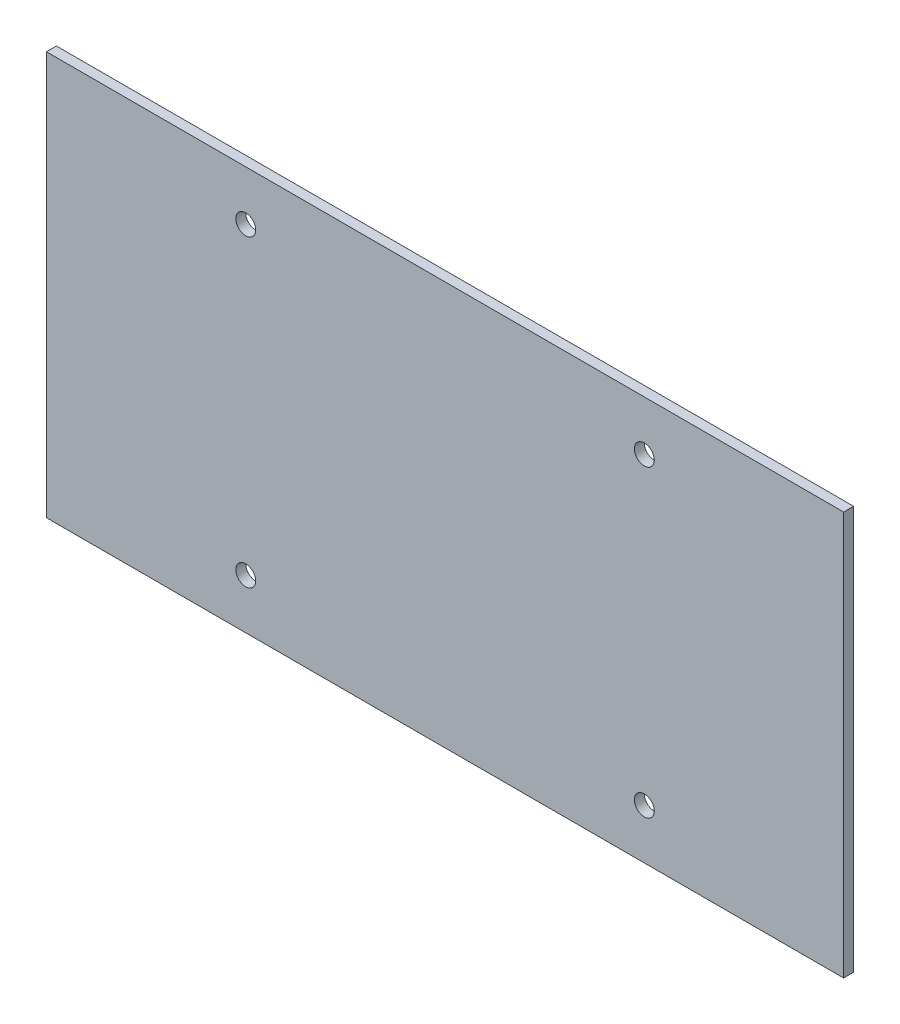
ISO-10303-21;
HEADER;
FILE_DESCRIPTION(('STEP AP214'),'2;1');
FILE_NAME('part.step','',(''),(''),'','','');
FILE_SCHEMA(('AUTOMOTIVE_DESIGN { 1 0 10303 214 1 1 1 1 }'));
ENDSEC;
DATA;
#1=APPLICATION_CONTEXT('core data for automotive mechanical design processes');
#2=APPLICATION_PROTOCOL_DEFINITION('international standard','automotive_design',2000,#1);
#3=PRODUCT_CONTEXT('',#1,'mechanical');
#4=PRODUCT('Part','Part','',(#3));
#5=PRODUCT_RELATED_PRODUCT_CATEGORY('part','',(#4));
#6=PRODUCT_DEFINITION_FORMATION('','',#4);
#7=PRODUCT_DEFINITION_CONTEXT('part definition',#1,'design');
#8=PRODUCT_DEFINITION('design','',#6,#7);
#9=PRODUCT_DEFINITION_SHAPE('','',#8);
#10=(LENGTH_UNIT() NAMED_UNIT(*) SI_UNIT(.MILLI.,.METRE.));
#11=(NAMED_UNIT(*) PLANE_ANGLE_UNIT() SI_UNIT($,.RADIAN.));
#12=(NAMED_UNIT(*) SI_UNIT($,.STERADIAN.) SOLID_ANGLE_UNIT());
#13=UNCERTAINTY_MEASURE_WITH_UNIT(LENGTH_MEASURE(1.E-05),#10,'distance_accuracy_value','');
#14=(GEOMETRIC_REPRESENTATION_CONTEXT(3) GLOBAL_UNCERTAINTY_ASSIGNED_CONTEXT((#13)) GLOBAL_UNIT_ASSIGNED_CONTEXT((#10,
#11,#12)) REPRESENTATION_CONTEXT('',''));
#15=CARTESIAN_POINT('',(0.,0.,0.));
#16=DIRECTION('',(0.,0.,1.));
#17=DIRECTION('',(1.,0.,0.));
#18=AXIS2_PLACEMENT_3D('',#15,#16,#17);
#19=CARTESIAN_POINT('',(0.,0.,2.));
#20=DIRECTION('',(0.,0.,-1.));
#21=DIRECTION('',(-1.,0.,0.));
#22=AXIS2_PLACEMENT_3D('',#19,#20,#21);
#23=PLANE('',#22);
#24=DIRECTION('',(0.,-1.,0.));
#25=VECTOR('',#24,1.);
#26=CARTESIAN_POINT('',(0.,0.,2.));
#27=LINE('',#26,#25);
#28=CARTESIAN_POINT('',(0.,81.,2.));
#29=VERTEX_POINT('',#28);
#30=CARTESIAN_POINT('',(0.,0.,2.));
#31=VERTEX_POINT('',#30);
#32=EDGE_CURVE('E92',#29,#31,#27,.T.);
#33=ORIENTED_EDGE('',*,*,#32,.T.);
#34=DIRECTION('',(1.,0.,0.));
#35=VECTOR('',#34,1.);
#36=CARTESIAN_POINT('',(0.,0.,2.));
#37=LINE('',#36,#35);
#38=CARTESIAN_POINT('',(160.,0.,2.));
#39=VERTEX_POINT('',#38);
#40=EDGE_CURVE('E87',#31,#39,#37,.T.);
#41=ORIENTED_EDGE('',*,*,#40,.T.);
#42=DIRECTION('',(0.,1.,0.));
#43=VECTOR('',#42,1.);
#44=CARTESIAN_POINT('',(160.,0.,2.));
#45=LINE('',#44,#43);
#46=CARTESIAN_POINT('',(160.,81.,2.));
#47=VERTEX_POINT('',#46);
#48=EDGE_CURVE('E90',#39,#47,#45,.T.);
#49=ORIENTED_EDGE('',*,*,#48,.T.);
#50=DIRECTION('',(-1.,0.,0.));
#51=VECTOR('',#50,1.);
#52=CARTESIAN_POINT('',(0.,81.,2.));
#53=LINE('',#52,#51);
#54=EDGE_CURVE('E57',#47,#29,#53,.T.);
#55=ORIENTED_EDGE('',*,*,#54,.T.);
#56=EDGE_LOOP('',(#33,#41,#49,#55));
#57=FACE_BOUND('',#56,.T.);
#58=CARTESIAN_POINT('',(40.,71.,2.));
#59=DIRECTION('',(0.,0.,1.));
#60=DIRECTION('',(1.,0.,0.));
#61=AXIS2_PLACEMENT_3D('',#58,#59,#60);
#62=CIRCLE('',#61,2.);
#63=CARTESIAN_POINT('',(42.,71.,2.));
#64=VERTEX_POINT('',#63);
#65=EDGE_CURVE('E112',#64,#64,#62,.T.);
#66=ORIENTED_EDGE('',*,*,#65,.F.);
#67=EDGE_LOOP('',(#66));
#68=FACE_BOUND('',#67,.T.);
#69=CARTESIAN_POINT('',(120.,71.,2.));
#70=DIRECTION('',(0.,0.,1.));
#71=DIRECTION('',(1.,0.,0.));
#72=AXIS2_PLACEMENT_3D('',#69,#70,#71);
#73=CIRCLE('',#72,2.);
#74=CARTESIAN_POINT('',(122.,71.,2.));
#75=VERTEX_POINT('',#74);
#76=EDGE_CURVE('E134',#75,#75,#73,.T.);
#77=ORIENTED_EDGE('',*,*,#76,.F.);
#78=EDGE_LOOP('',(#77));
#79=FACE_BOUND('',#78,.T.);
#80=CARTESIAN_POINT('',(40.,10.,2.));
#81=DIRECTION('',(0.,0.,1.));
#82=DIRECTION('',(1.,0.,0.));
#83=AXIS2_PLACEMENT_3D('',#80,#81,#82);
#84=CIRCLE('',#83,2.);
#85=CARTESIAN_POINT('',(42.,10.,2.));
#86=VERTEX_POINT('',#85);
#87=EDGE_CURVE('E142',#86,#86,#84,.T.);
#88=ORIENTED_EDGE('',*,*,#87,.F.);
#89=EDGE_LOOP('',(#88));
#90=FACE_BOUND('',#89,.T.);
#91=CARTESIAN_POINT('',(120.,10.,2.));
#92=DIRECTION('',(0.,0.,1.));
#93=DIRECTION('',(1.,0.,0.));
#94=AXIS2_PLACEMENT_3D('',#91,#92,#93);
#95=CIRCLE('',#94,2.);
#96=CARTESIAN_POINT('',(122.,10.,2.));
#97=VERTEX_POINT('',#96);
#98=EDGE_CURVE('E150',#97,#97,#95,.T.);
#99=ORIENTED_EDGE('',*,*,#98,.F.);
#100=EDGE_LOOP('',(#99));
#101=FACE_BOUND('',#100,.T.);
#102=ADVANCED_FACE('F39',(#57,#68,#79,#90,#101),#23,.F.);
#103=CARTESIAN_POINT('',(0.,0.,0.));
#104=DIRECTION('',(0.,0.,-1.));
#105=DIRECTION('',(-1.,0.,0.));
#106=AXIS2_PLACEMENT_3D('',#103,#104,#105);
#107=PLANE('',#106);
#108=CARTESIAN_POINT('',(40.,10.,0.));
#109=DIRECTION('',(0.,0.,1.));
#110=DIRECTION('',(1.,0.,0.));
#111=AXIS2_PLACEMENT_3D('',#108,#109,#110);
#112=CIRCLE('',#111,2.);
#113=CARTESIAN_POINT('',(42.,10.,0.));
#114=VERTEX_POINT('',#113);
#115=EDGE_CURVE('E146',#114,#114,#112,.T.);
#116=ORIENTED_EDGE('',*,*,#115,.T.);
#117=EDGE_LOOP('',(#116));
#118=FACE_BOUND('',#117,.T.);
#119=CARTESIAN_POINT('',(40.,71.,0.));
#120=DIRECTION('',(0.,0.,1.));
#121=DIRECTION('',(1.,0.,0.));
#122=AXIS2_PLACEMENT_3D('',#119,#120,#121);
#123=CIRCLE('',#122,2.);
#124=CARTESIAN_POINT('',(42.,71.,0.));
#125=VERTEX_POINT('',#124);
#126=EDGE_CURVE('E130',#125,#125,#123,.T.);
#127=ORIENTED_EDGE('',*,*,#126,.T.);
#128=EDGE_LOOP('',(#127));
#129=FACE_BOUND('',#128,.T.);
#130=DIRECTION('',(0.,-1.,0.));
#131=VECTOR('',#130,1.);
#132=CARTESIAN_POINT('',(0.,0.,0.));
#133=LINE('',#132,#131);
#134=CARTESIAN_POINT('',(0.,81.,0.));
#135=VERTEX_POINT('',#134);
#136=CARTESIAN_POINT('',(0.,0.,0.));
#137=VERTEX_POINT('',#136);
#138=EDGE_CURVE('E108',#135,#137,#133,.T.);
#139=ORIENTED_EDGE('',*,*,#138,.F.);
#140=DIRECTION('',(-1.,0.,0.));
#141=VECTOR('',#140,1.);
#142=CARTESIAN_POINT('',(0.,81.,0.));
#143=LINE('',#142,#141);
#144=CARTESIAN_POINT('',(160.,81.,0.));
#145=VERTEX_POINT('',#144);
#146=EDGE_CURVE('E80',#145,#135,#143,.T.);
#147=ORIENTED_EDGE('',*,*,#146,.F.);
#148=DIRECTION('',(0.,1.,0.));
#149=VECTOR('',#148,1.);
#150=CARTESIAN_POINT('',(160.,0.,0.));
#151=LINE('',#150,#149);
#152=CARTESIAN_POINT('',(160.,0.,0.));
#153=VERTEX_POINT('',#152);
#154=EDGE_CURVE('E74',#153,#145,#151,.T.);
#155=ORIENTED_EDGE('',*,*,#154,.F.);
#156=DIRECTION('',(1.,0.,0.));
#157=VECTOR('',#156,1.);
#158=CARTESIAN_POINT('',(0.,0.,0.));
#159=LINE('',#158,#157);
#160=EDGE_CURVE('E97',#137,#153,#159,.T.);
#161=ORIENTED_EDGE('',*,*,#160,.F.);
#162=EDGE_LOOP('',(#139,#147,#155,#161));
#163=FACE_BOUND('',#162,.T.);
#164=CARTESIAN_POINT('',(120.,71.,0.));
#165=DIRECTION('',(0.,0.,1.));
#166=DIRECTION('',(1.,0.,0.));
#167=AXIS2_PLACEMENT_3D('',#164,#165,#166);
#168=CIRCLE('',#167,2.);
#169=CARTESIAN_POINT('',(122.,71.,0.));
#170=VERTEX_POINT('',#169);
#171=EDGE_CURVE('E138',#170,#170,#168,.T.);
#172=ORIENTED_EDGE('',*,*,#171,.T.);
#173=EDGE_LOOP('',(#172));
#174=FACE_BOUND('',#173,.T.);
#175=CARTESIAN_POINT('',(120.,10.,0.));
#176=DIRECTION('',(0.,0.,1.));
#177=DIRECTION('',(1.,0.,0.));
#178=AXIS2_PLACEMENT_3D('',#175,#176,#177);
#179=CIRCLE('',#178,2.);
#180=CARTESIAN_POINT('',(122.,10.,0.));
#181=VERTEX_POINT('',#180);
#182=EDGE_CURVE('E154',#181,#181,#179,.T.);
#183=ORIENTED_EDGE('',*,*,#182,.T.);
#184=EDGE_LOOP('',(#183));
#185=FACE_BOUND('',#184,.T.);
#186=ADVANCED_FACE('F125',(#118,#129,#163,#174,#185),#107,.T.);
#187=CARTESIAN_POINT('',(0.,0.,2.));
#188=DIRECTION('',(1.,0.,0.));
#189=DIRECTION('',(0.,0.,-1.));
#190=AXIS2_PLACEMENT_3D('',#187,#188,#189);
#191=PLANE('',#190);
#192=ORIENTED_EDGE('',*,*,#138,.T.);
#193=DIRECTION('',(0.,0.,-1.));
#194=VECTOR('',#193,1.);
#195=CARTESIAN_POINT('',(0.,0.,2.));
#196=LINE('',#195,#194);
#197=EDGE_CURVE('E11',#31,#137,#196,.T.);
#198=ORIENTED_EDGE('',*,*,#197,.F.);
#199=ORIENTED_EDGE('',*,*,#32,.F.);
#200=DIRECTION('',(0.,0.,-1.));
#201=VECTOR('',#200,1.);
#202=CARTESIAN_POINT('',(0.,81.,2.));
#203=LINE('',#202,#201);
#204=EDGE_CURVE('E104',#29,#135,#203,.T.);
#205=ORIENTED_EDGE('',*,*,#204,.T.);
#206=EDGE_LOOP('',(#192,#198,#199,#205));
#207=FACE_BOUND('',#206,.T.);
#208=ADVANCED_FACE('F41',(#207),#191,.F.);
#209=CARTESIAN_POINT('',(0.,0.,2.));
#210=DIRECTION('',(0.,1.,0.));
#211=DIRECTION('',(0.,0.,1.));
#212=AXIS2_PLACEMENT_3D('',#209,#210,#211);
#213=PLANE('',#212);
#214=ORIENTED_EDGE('',*,*,#160,.T.);
#215=DIRECTION('',(0.,0.,-1.));
#216=VECTOR('',#215,1.);
#217=CARTESIAN_POINT('',(160.,0.,2.));
#218=LINE('',#217,#216);
#219=EDGE_CURVE('E49',#39,#153,#218,.T.);
#220=ORIENTED_EDGE('',*,*,#219,.F.);
#221=ORIENTED_EDGE('',*,*,#40,.F.);
#222=ORIENTED_EDGE('',*,*,#197,.T.);
#223=EDGE_LOOP('',(#214,#220,#221,#222));
#224=FACE_BOUND('',#223,.T.);
#225=ADVANCED_FACE('F96',(#224),#213,.F.);
#226=CARTESIAN_POINT('',(160.,0.,2.));
#227=DIRECTION('',(-1.,0.,0.));
#228=DIRECTION('',(0.,0.,1.));
#229=AXIS2_PLACEMENT_3D('',#226,#227,#228);
#230=PLANE('',#229);
#231=ORIENTED_EDGE('',*,*,#154,.T.);
#232=DIRECTION('',(0.,0.,-1.));
#233=VECTOR('',#232,1.);
#234=CARTESIAN_POINT('',(160.,81.,2.));
#235=LINE('',#234,#233);
#236=EDGE_CURVE('E99',#47,#145,#235,.T.);
#237=ORIENTED_EDGE('',*,*,#236,.F.);
#238=ORIENTED_EDGE('',*,*,#48,.F.);
#239=ORIENTED_EDGE('',*,*,#219,.T.);
#240=EDGE_LOOP('',(#231,#237,#238,#239));
#241=FACE_BOUND('',#240,.T.);
#242=ADVANCED_FACE('F100',(#241),#230,.F.);
#243=CARTESIAN_POINT('',(0.,81.,2.));
#244=DIRECTION('',(0.,-1.,0.));
#245=DIRECTION('',(0.,0.,-1.));
#246=AXIS2_PLACEMENT_3D('',#243,#244,#245);
#247=PLANE('',#246);
#248=ORIENTED_EDGE('',*,*,#146,.T.);
#249=ORIENTED_EDGE('',*,*,#204,.F.);
#250=ORIENTED_EDGE('',*,*,#54,.F.);
#251=ORIENTED_EDGE('',*,*,#236,.T.);
#252=EDGE_LOOP('',(#248,#249,#250,#251));
#253=FACE_BOUND('',#252,.T.);
#254=ADVANCED_FACE('F122',(#253),#247,.F.);
#255=CARTESIAN_POINT('',(40.,71.,2.));
#256=DIRECTION('',(0.,0.,-1.));
#257=DIRECTION('',(-1.,0.,0.));
#258=AXIS2_PLACEMENT_3D('',#255,#256,#257);
#259=CYLINDRICAL_SURFACE('',#258,2.);
#260=ORIENTED_EDGE('',*,*,#65,.T.);
#261=EDGE_LOOP('',(#260));
#262=FACE_BOUND('',#261,.T.);
#263=ORIENTED_EDGE('',*,*,#126,.F.);
#264=EDGE_LOOP('',(#263));
#265=FACE_BOUND('',#264,.T.);
#266=ADVANCED_FACE('F173',(#262,#265),#259,.F.);
#267=CARTESIAN_POINT('',(120.,71.,2.));
#268=DIRECTION('',(0.,0.,-1.));
#269=DIRECTION('',(-1.,0.,0.));
#270=AXIS2_PLACEMENT_3D('',#267,#268,#269);
#271=CYLINDRICAL_SURFACE('',#270,2.);
#272=ORIENTED_EDGE('',*,*,#76,.T.);
#273=EDGE_LOOP('',(#272));
#274=FACE_BOUND('',#273,.T.);
#275=ORIENTED_EDGE('',*,*,#171,.F.);
#276=EDGE_LOOP('',(#275));
#277=FACE_BOUND('',#276,.T.);
#278=ADVANCED_FACE('F219',(#274,#277),#271,.F.);
#279=CARTESIAN_POINT('',(40.,10.,2.));
#280=DIRECTION('',(0.,0.,-1.));
#281=DIRECTION('',(-1.,0.,0.));
#282=AXIS2_PLACEMENT_3D('',#279,#280,#281);
#283=CYLINDRICAL_SURFACE('',#282,2.);
#284=ORIENTED_EDGE('',*,*,#87,.T.);
#285=EDGE_LOOP('',(#284));
#286=FACE_BOUND('',#285,.T.);
#287=ORIENTED_EDGE('',*,*,#115,.F.);
#288=EDGE_LOOP('',(#287));
#289=FACE_BOUND('',#288,.T.);
#290=ADVANCED_FACE('F227',(#286,#289),#283,.F.);
#291=CARTESIAN_POINT('',(120.,10.,2.));
#292=DIRECTION('',(0.,0.,-1.));
#293=DIRECTION('',(-1.,0.,0.));
#294=AXIS2_PLACEMENT_3D('',#291,#292,#293);
#295=CYLINDRICAL_SURFACE('',#294,2.);
#296=ORIENTED_EDGE('',*,*,#98,.T.);
#297=EDGE_LOOP('',(#296));
#298=FACE_BOUND('',#297,.T.);
#299=ORIENTED_EDGE('',*,*,#182,.F.);
#300=EDGE_LOOP('',(#299));
#301=FACE_BOUND('',#300,.T.);
#302=ADVANCED_FACE('F162',(#298,#301),#295,.F.);
#303=CLOSED_SHELL('',(#102,#186,#208,#225,#242,#254,#266,#278,#290,#302));
#304=MANIFOLD_SOLID_BREP('B2',#303);
#305=ADVANCED_BREP_SHAPE_REPRESENTATION('',(#18,#304),#14);
#306=SHAPE_DEFINITION_REPRESENTATION(#9,#305);
ENDSEC;
END-ISO-10303-21;
